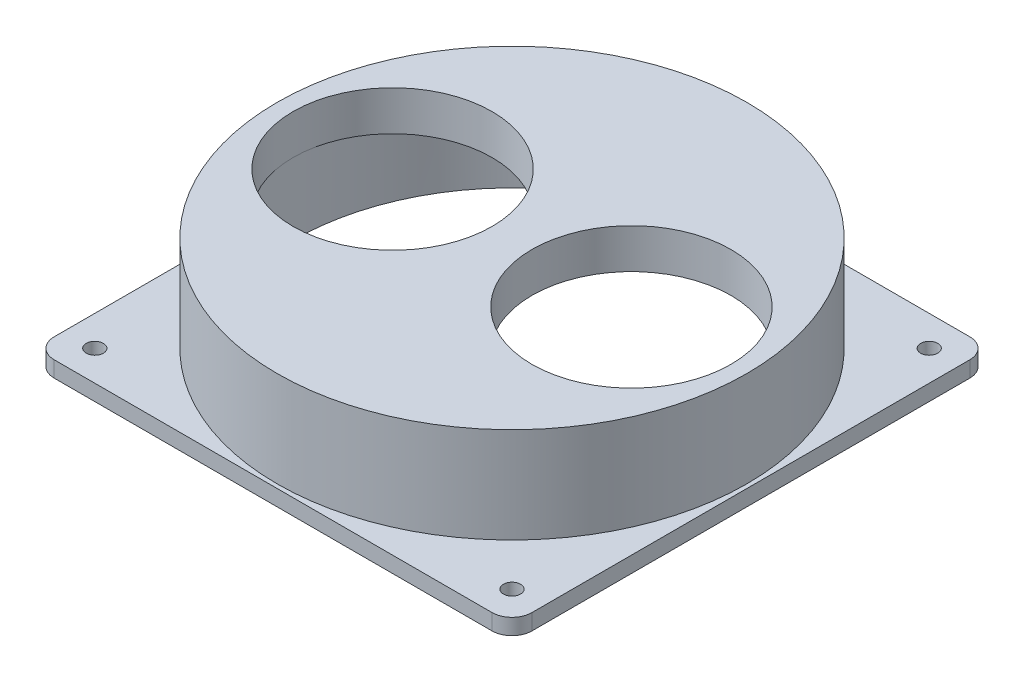
ISO-10303-21;
HEADER;
FILE_DESCRIPTION(('STEP AP214'),'2;1');
FILE_NAME('part.step','',(''),(''),'','','');
FILE_SCHEMA(('AUTOMOTIVE_DESIGN { 1 0 10303 214 1 1 1 1 }'));
ENDSEC;
DATA;
#1=APPLICATION_CONTEXT('core data for automotive mechanical design processes');
#2=APPLICATION_PROTOCOL_DEFINITION('international standard','automotive_design',2000,#1);
#3=PRODUCT_CONTEXT('',#1,'mechanical');
#4=PRODUCT('Part','Part','',(#3));
#5=PRODUCT_RELATED_PRODUCT_CATEGORY('part','',(#4));
#6=PRODUCT_DEFINITION_FORMATION('','',#4);
#7=PRODUCT_DEFINITION_CONTEXT('part definition',#1,'design');
#8=PRODUCT_DEFINITION('design','',#6,#7);
#9=PRODUCT_DEFINITION_SHAPE('','',#8);
#10=(LENGTH_UNIT() NAMED_UNIT(*) SI_UNIT(.MILLI.,.METRE.));
#11=(NAMED_UNIT(*) PLANE_ANGLE_UNIT() SI_UNIT($,.RADIAN.));
#12=(NAMED_UNIT(*) SI_UNIT($,.STERADIAN.) SOLID_ANGLE_UNIT());
#13=UNCERTAINTY_MEASURE_WITH_UNIT(LENGTH_MEASURE(1.E-05),#10,'distance_accuracy_value','');
#14=(GEOMETRIC_REPRESENTATION_CONTEXT(3) GLOBAL_UNCERTAINTY_ASSIGNED_CONTEXT((#13)) GLOBAL_UNIT_ASSIGNED_CONTEXT((#10,
#11,#12)) REPRESENTATION_CONTEXT('',''));
#15=CARTESIAN_POINT('',(0.,0.,0.));
#16=DIRECTION('',(0.,0.,1.));
#17=DIRECTION('',(1.,0.,0.));
#18=AXIS2_PLACEMENT_3D('',#15,#16,#17);
#19=CARTESIAN_POINT('',(0.,0.,0.));
#20=DIRECTION('',(0.,1.,0.));
#21=DIRECTION('',(0.,0.,1.));
#22=AXIS2_PLACEMENT_3D('',#19,#20,#21);
#23=CYLINDRICAL_SURFACE('',#22,55.);
#24=CARTESIAN_POINT('',(0.,0.,0.));
#25=DIRECTION('',(0.,1.,0.));
#26=DIRECTION('',(0.,0.,1.));
#27=AXIS2_PLACEMENT_3D('',#24,#25,#26);
#28=CIRCLE('',#27,55.);
#29=CARTESIAN_POINT('',(0.,0.,55.));
#30=VERTEX_POINT('',#29);
#31=EDGE_CURVE('E180',#30,#30,#28,.T.);
#32=ORIENTED_EDGE('',*,*,#31,.F.);
#33=EDGE_LOOP('',(#32));
#34=FACE_BOUND('',#33,.T.);
#35=DIRECTION('',(0.,1.,0.));
#36=VECTOR('',#35,1.);
#37=CARTESIAN_POINT('',(-51.4,21.,-19.5714077163601));
#38=LINE('',#37,#36);
#39=CARTESIAN_POINT('',(-51.4,18.,-19.5714077163601));
#40=VERTEX_POINT('',#39);
#41=CARTESIAN_POINT('',(-51.4,24.,-19.5714077163601));
#42=VERTEX_POINT('',#41);
#43=EDGE_CURVE('E48',#40,#42,#38,.T.);
#44=ORIENTED_EDGE('',*,*,#43,.F.);
#45=CARTESIAN_POINT('',(0.,18.,0.));
#46=DIRECTION('',(0.,-1.,0.));
#47=DIRECTION('',(0.,0.,-1.));
#48=AXIS2_PLACEMENT_3D('',#45,#46,#47);
#49=CIRCLE('',#48,55.);
#50=CARTESIAN_POINT('',(-55.,18.,0.));
#51=VERTEX_POINT('',#50);
#52=EDGE_CURVE('E153',#40,#51,#49,.F.);
#53=ORIENTED_EDGE('',*,*,#52,.T.);
#54=CARTESIAN_POINT('',(-51.4,18.,19.5714077163601));
#55=VERTEX_POINT('',#54);
#56=EDGE_CURVE('E54',#51,#55,#49,.F.);
#57=ORIENTED_EDGE('',*,*,#56,.T.);
#58=DIRECTION('',(0.,1.,0.));
#59=VECTOR('',#58,1.);
#60=CARTESIAN_POINT('',(-51.4,21.,19.5714077163601));
#61=LINE('',#60,#59);
#62=CARTESIAN_POINT('',(-51.4,24.,19.5714077163601));
#63=VERTEX_POINT('',#62);
#64=EDGE_CURVE('E138',#63,#55,#61,.F.);
#65=ORIENTED_EDGE('',*,*,#64,.F.);
#66=CARTESIAN_POINT('',(0.,24.,0.));
#67=DIRECTION('',(0.,1.,0.));
#68=DIRECTION('',(0.,0.,1.));
#69=AXIS2_PLACEMENT_3D('',#66,#67,#68);
#70=CIRCLE('',#69,55.);
#71=CARTESIAN_POINT('',(51.4,24.,19.5714077163601));
#72=VERTEX_POINT('',#71);
#73=EDGE_CURVE('E128',#72,#63,#70,.F.);
#74=ORIENTED_EDGE('',*,*,#73,.F.);
#75=DIRECTION('',(0.,1.,0.));
#76=VECTOR('',#75,1.);
#77=CARTESIAN_POINT('',(51.4,21.,19.5714077163601));
#78=LINE('',#77,#76);
#79=CARTESIAN_POINT('',(51.4,18.,19.5714077163601));
#80=VERTEX_POINT('',#79);
#81=EDGE_CURVE('E160',#80,#72,#78,.T.);
#82=ORIENTED_EDGE('',*,*,#81,.F.);
#83=CARTESIAN_POINT('',(0.,18.,0.));
#84=DIRECTION('',(0.,-1.,0.));
#85=DIRECTION('',(0.,0.,-1.));
#86=AXIS2_PLACEMENT_3D('',#83,#84,#85);
#87=CIRCLE('',#86,55.);
#88=CARTESIAN_POINT('',(55.,18.,0.));
#89=VERTEX_POINT('',#88);
#90=EDGE_CURVE('E168',#80,#89,#87,.F.);
#91=ORIENTED_EDGE('',*,*,#90,.T.);
#92=CARTESIAN_POINT('',(51.4,18.,-19.5714077163601));
#93=VERTEX_POINT('',#92);
#94=EDGE_CURVE('E166',#89,#93,#87,.F.);
#95=ORIENTED_EDGE('',*,*,#94,.T.);
#96=DIRECTION('',(0.,1.,0.));
#97=VECTOR('',#96,1.);
#98=CARTESIAN_POINT('',(51.4,21.,-19.5714077163601));
#99=LINE('',#98,#97);
#100=CARTESIAN_POINT('',(51.4,24.,-19.5714077163601));
#101=VERTEX_POINT('',#100);
#102=EDGE_CURVE('E163',#101,#93,#99,.F.);
#103=ORIENTED_EDGE('',*,*,#102,.F.);
#104=EDGE_CURVE('E136',#42,#101,#70,.F.);
#105=ORIENTED_EDGE('',*,*,#104,.F.);
#106=EDGE_LOOP('',(#44,#53,#57,#65,#74,#82,#91,#95,#103,#105));
#107=FACE_BOUND('',#106,.T.);
#108=ADVANCED_FACE('F33',(#34,#107),#23,.F.);
#109=CARTESIAN_POINT('',(0.,24.,0.));
#110=DIRECTION('',(0.,1.,0.));
#111=DIRECTION('',(0.,0.,1.));
#112=AXIS2_PLACEMENT_3D('',#109,#110,#111);
#113=PLANE('',#112);
#114=CARTESIAN_POINT('',(-30.,24.,0.));
#115=DIRECTION('',(0.,-1.,0.));
#116=DIRECTION('',(0.,0.,-1.));
#117=AXIS2_PLACEMENT_3D('',#114,#115,#116);
#118=CIRCLE('',#117,29.);
#119=EDGE_CURVE('E131',#42,#63,#118,.T.);
#120=ORIENTED_EDGE('',*,*,#119,.F.);
#121=ORIENTED_EDGE('',*,*,#104,.T.);
#122=CARTESIAN_POINT('',(30.,24.,0.));
#123=DIRECTION('',(0.,-1.,0.));
#124=DIRECTION('',(0.,0.,-1.));
#125=AXIS2_PLACEMENT_3D('',#122,#123,#124);
#126=CIRCLE('',#125,29.);
#127=EDGE_CURVE('E133',#72,#101,#126,.T.);
#128=ORIENTED_EDGE('',*,*,#127,.F.);
#129=ORIENTED_EDGE('',*,*,#73,.T.);
#130=EDGE_LOOP('',(#120,#121,#128,#129));
#131=FACE_BOUND('',#130,.T.);
#132=ADVANCED_FACE('F129',(#131),#113,.F.);
#133=CARTESIAN_POINT('',(0.,4.,0.));
#134=DIRECTION('',(0.,1.,0.));
#135=DIRECTION('',(0.,0.,1.));
#136=AXIS2_PLACEMENT_3D('',#133,#134,#135);
#137=PLANE('',#136);
#138=DIRECTION('',(0.,0.,-1.));
#139=VECTOR('',#138,1.);
#140=CARTESIAN_POINT('',(60.,4.,-60.));
#141=LINE('',#140,#139);
#142=CARTESIAN_POINT('',(60.,4.,55.));
#143=VERTEX_POINT('',#142);
#144=CARTESIAN_POINT('',(60.,4.,-55.));
#145=VERTEX_POINT('',#144);
#146=EDGE_CURVE('E208',#143,#145,#141,.T.);
#147=ORIENTED_EDGE('',*,*,#146,.T.);
#148=CARTESIAN_POINT('',(55.,4.,-55.));
#149=DIRECTION('',(0.,1.,0.));
#150=DIRECTION('',(0.,0.,1.));
#151=AXIS2_PLACEMENT_3D('',#148,#149,#150);
#152=CIRCLE('',#151,5.);
#153=CARTESIAN_POINT('',(55.,4.,-60.));
#154=VERTEX_POINT('',#153);
#155=EDGE_CURVE('E255',#145,#154,#152,.T.);
#156=ORIENTED_EDGE('',*,*,#155,.T.);
#157=DIRECTION('',(-1.,0.,0.));
#158=VECTOR('',#157,1.);
#159=CARTESIAN_POINT('',(-60.,4.,-60.));
#160=LINE('',#159,#158);
#161=CARTESIAN_POINT('',(-55.,4.,-60.));
#162=VERTEX_POINT('',#161);
#163=EDGE_CURVE('E211',#154,#162,#160,.T.);
#164=ORIENTED_EDGE('',*,*,#163,.T.);
#165=CARTESIAN_POINT('',(-55.,4.,-55.));
#166=DIRECTION('',(0.,1.,0.));
#167=DIRECTION('',(0.,0.,1.));
#168=AXIS2_PLACEMENT_3D('',#165,#166,#167);
#169=CIRCLE('',#168,5.);
#170=CARTESIAN_POINT('',(-60.,4.,-55.));
#171=VERTEX_POINT('',#170);
#172=EDGE_CURVE('E253',#162,#171,#169,.T.);
#173=ORIENTED_EDGE('',*,*,#172,.T.);
#174=DIRECTION('',(0.,0.,1.));
#175=VECTOR('',#174,1.);
#176=CARTESIAN_POINT('',(-60.,4.,-60.));
#177=LINE('',#176,#175);
#178=CARTESIAN_POINT('',(-60.,4.,55.));
#179=VERTEX_POINT('',#178);
#180=EDGE_CURVE('E215',#171,#179,#177,.T.);
#181=ORIENTED_EDGE('',*,*,#180,.T.);
#182=CARTESIAN_POINT('',(-55.,4.,55.));
#183=DIRECTION('',(0.,1.,0.));
#184=DIRECTION('',(0.,0.,1.));
#185=AXIS2_PLACEMENT_3D('',#182,#183,#184);
#186=CIRCLE('',#185,5.);
#187=CARTESIAN_POINT('',(-55.,4.,60.));
#188=VERTEX_POINT('',#187);
#189=EDGE_CURVE('E251',#179,#188,#186,.T.);
#190=ORIENTED_EDGE('',*,*,#189,.T.);
#191=DIRECTION('',(1.,0.,0.));
#192=VECTOR('',#191,1.);
#193=CARTESIAN_POINT('',(-60.,4.,60.));
#194=LINE('',#193,#192);
#195=CARTESIAN_POINT('',(55.,4.,60.));
#196=VERTEX_POINT('',#195);
#197=EDGE_CURVE('E218',#188,#196,#194,.T.);
#198=ORIENTED_EDGE('',*,*,#197,.T.);
#199=CARTESIAN_POINT('',(55.,4.,55.));
#200=DIRECTION('',(0.,1.,0.));
#201=DIRECTION('',(0.,0.,1.));
#202=AXIS2_PLACEMENT_3D('',#199,#200,#201);
#203=CIRCLE('',#202,5.);
#204=EDGE_CURVE('E249',#196,#143,#203,.T.);
#205=ORIENTED_EDGE('',*,*,#204,.T.);
#206=EDGE_LOOP('',(#147,#156,#164,#173,#181,#190,#198,#205));
#207=FACE_BOUND('',#206,.T.);
#208=CARTESIAN_POINT('',(-52.4,4.,-52.4));
#209=DIRECTION('',(0.,1.,0.));
#210=DIRECTION('',(0.,0.,1.));
#211=AXIS2_PLACEMENT_3D('',#208,#209,#210);
#212=CIRCLE('',#211,2.15);
#213=CARTESIAN_POINT('',(-52.4,4.,-50.25));
#214=VERTEX_POINT('',#213);
#215=EDGE_CURVE('E187',#214,#214,#212,.T.);
#216=ORIENTED_EDGE('',*,*,#215,.F.);
#217=EDGE_LOOP('',(#216));
#218=FACE_BOUND('',#217,.T.);
#219=CARTESIAN_POINT('',(52.4,4.,52.4));
#220=DIRECTION('',(0.,1.,0.));
#221=DIRECTION('',(0.,0.,1.));
#222=AXIS2_PLACEMENT_3D('',#219,#220,#221);
#223=CIRCLE('',#222,2.15);
#224=CARTESIAN_POINT('',(52.4,4.,54.55));
#225=VERTEX_POINT('',#224);
#226=EDGE_CURVE('E183',#225,#225,#223,.T.);
#227=ORIENTED_EDGE('',*,*,#226,.F.);
#228=EDGE_LOOP('',(#227));
#229=FACE_BOUND('',#228,.T.);
#230=CARTESIAN_POINT('',(-52.4,4.,52.4));
#231=DIRECTION('',(0.,1.,0.));
#232=DIRECTION('',(0.,0.,1.));
#233=AXIS2_PLACEMENT_3D('',#230,#231,#232);
#234=CIRCLE('',#233,2.15);
#235=CARTESIAN_POINT('',(-52.4,4.,54.55));
#236=VERTEX_POINT('',#235);
#237=EDGE_CURVE('E194',#236,#236,#234,.T.);
#238=ORIENTED_EDGE('',*,*,#237,.F.);
#239=EDGE_LOOP('',(#238));
#240=FACE_BOUND('',#239,.T.);
#241=CARTESIAN_POINT('',(52.4,4.,-52.4));
#242=DIRECTION('',(0.,1.,0.));
#243=DIRECTION('',(0.,0.,1.));
#244=AXIS2_PLACEMENT_3D('',#241,#242,#243);
#245=CIRCLE('',#244,2.15);
#246=CARTESIAN_POINT('',(52.4,4.,-50.25));
#247=VERTEX_POINT('',#246);
#248=EDGE_CURVE('E188',#247,#247,#245,.T.);
#249=ORIENTED_EDGE('',*,*,#248,.F.);
#250=EDGE_LOOP('',(#249));
#251=FACE_BOUND('',#250,.T.);
#252=CARTESIAN_POINT('',(0.,4.,0.));
#253=DIRECTION('',(0.,1.,0.));
#254=DIRECTION('',(0.,0.,1.));
#255=AXIS2_PLACEMENT_3D('',#252,#253,#254);
#256=CIRCLE('',#255,59.);
#257=CARTESIAN_POINT('',(0.,4.,59.));
#258=VERTEX_POINT('',#257);
#259=EDGE_CURVE('E135',#258,#258,#256,.T.);
#260=ORIENTED_EDGE('',*,*,#259,.F.);
#261=EDGE_LOOP('',(#260));
#262=FACE_BOUND('',#261,.T.);
#263=ADVANCED_FACE('F270',(#207,#218,#229,#240,#251,#262),#137,.T.);
#264=CARTESIAN_POINT('',(60.,4.,-60.));
#265=DIRECTION('',(-1.,0.,0.));
#266=DIRECTION('',(0.,0.,1.));
#267=AXIS2_PLACEMENT_3D('',#264,#265,#266);
#268=PLANE('',#267);
#269=DIRECTION('',(0.,0.,-1.));
#270=VECTOR('',#269,1.);
#271=CARTESIAN_POINT('',(60.,0.,-60.));
#272=LINE('',#271,#270);
#273=CARTESIAN_POINT('',(60.,0.,55.));
#274=VERTEX_POINT('',#273);
#275=CARTESIAN_POINT('',(60.,0.,-55.));
#276=VERTEX_POINT('',#275);
#277=EDGE_CURVE('E205',#274,#276,#272,.T.);
#278=ORIENTED_EDGE('',*,*,#277,.T.);
#279=DIRECTION('',(0.,-1.,0.));
#280=VECTOR('',#279,1.);
#281=CARTESIAN_POINT('',(60.,4.,-55.));
#282=LINE('',#281,#280);
#283=EDGE_CURVE('E247',#276,#145,#282,.F.);
#284=ORIENTED_EDGE('',*,*,#283,.T.);
#285=ORIENTED_EDGE('',*,*,#146,.F.);
#286=DIRECTION('',(0.,-1.,0.));
#287=VECTOR('',#286,1.);
#288=CARTESIAN_POINT('',(60.,4.,55.));
#289=LINE('',#288,#287);
#290=EDGE_CURVE('E244',#143,#274,#289,.T.);
#291=ORIENTED_EDGE('',*,*,#290,.T.);
#292=EDGE_LOOP('',(#278,#284,#285,#291));
#293=FACE_BOUND('',#292,.T.);
#294=ADVANCED_FACE('F277',(#293),#268,.F.);
#295=CARTESIAN_POINT('',(-60.,4.,-60.));
#296=DIRECTION('',(0.,0.,1.));
#297=DIRECTION('',(1.,0.,0.));
#298=AXIS2_PLACEMENT_3D('',#295,#296,#297);
#299=PLANE('',#298);
#300=ORIENTED_EDGE('',*,*,#163,.F.);
#301=DIRECTION('',(0.,-1.,0.));
#302=VECTOR('',#301,1.);
#303=CARTESIAN_POINT('',(55.,4.,-60.));
#304=LINE('',#303,#302);
#305=CARTESIAN_POINT('',(55.,0.,-60.));
#306=VERTEX_POINT('',#305);
#307=EDGE_CURVE('E233',#154,#306,#304,.T.);
#308=ORIENTED_EDGE('',*,*,#307,.T.);
#309=DIRECTION('',(-1.,0.,0.));
#310=VECTOR('',#309,1.);
#311=CARTESIAN_POINT('',(-60.,0.,-60.));
#312=LINE('',#311,#310);
#313=CARTESIAN_POINT('',(-55.,0.,-60.));
#314=VERTEX_POINT('',#313);
#315=EDGE_CURVE('E224',#306,#314,#312,.T.);
#316=ORIENTED_EDGE('',*,*,#315,.T.);
#317=DIRECTION('',(0.,-1.,0.));
#318=VECTOR('',#317,1.);
#319=CARTESIAN_POINT('',(-55.,4.,-60.));
#320=LINE('',#319,#318);
#321=EDGE_CURVE('E221',#314,#162,#320,.F.);
#322=ORIENTED_EDGE('',*,*,#321,.T.);
#323=EDGE_LOOP('',(#300,#308,#316,#322));
#324=FACE_BOUND('',#323,.T.);
#325=ADVANCED_FACE('F288',(#324),#299,.F.);
#326=CARTESIAN_POINT('',(-60.,4.,-60.));
#327=DIRECTION('',(1.,0.,0.));
#328=DIRECTION('',(0.,0.,-1.));
#329=AXIS2_PLACEMENT_3D('',#326,#327,#328);
#330=PLANE('',#329);
#331=ORIENTED_EDGE('',*,*,#180,.F.);
#332=DIRECTION('',(0.,-1.,0.));
#333=VECTOR('',#332,1.);
#334=CARTESIAN_POINT('',(-60.,4.,-55.));
#335=LINE('',#334,#333);
#336=CARTESIAN_POINT('',(-60.,0.,-55.));
#337=VERTEX_POINT('',#336);
#338=EDGE_CURVE('E259',#171,#337,#335,.T.);
#339=ORIENTED_EDGE('',*,*,#338,.T.);
#340=DIRECTION('',(0.,0.,1.));
#341=VECTOR('',#340,1.);
#342=CARTESIAN_POINT('',(-60.,0.,-60.));
#343=LINE('',#342,#341);
#344=CARTESIAN_POINT('',(-60.,0.,55.));
#345=VERTEX_POINT('',#344);
#346=EDGE_CURVE('E227',#337,#345,#343,.T.);
#347=ORIENTED_EDGE('',*,*,#346,.T.);
#348=DIRECTION('',(0.,-1.,0.));
#349=VECTOR('',#348,1.);
#350=CARTESIAN_POINT('',(-60.,4.,55.));
#351=LINE('',#350,#349);
#352=EDGE_CURVE('E257',#345,#179,#351,.F.);
#353=ORIENTED_EDGE('',*,*,#352,.T.);
#354=EDGE_LOOP('',(#331,#339,#347,#353));
#355=FACE_BOUND('',#354,.T.);
#356=ADVANCED_FACE('F297',(#355),#330,.F.);
#357=CARTESIAN_POINT('',(-60.,4.,60.));
#358=DIRECTION('',(0.,0.,-1.));
#359=DIRECTION('',(-1.,0.,0.));
#360=AXIS2_PLACEMENT_3D('',#357,#358,#359);
#361=PLANE('',#360);
#362=ORIENTED_EDGE('',*,*,#197,.F.);
#363=DIRECTION('',(0.,-1.,0.));
#364=VECTOR('',#363,1.);
#365=CARTESIAN_POINT('',(-55.,4.,60.));
#366=LINE('',#365,#364);
#367=CARTESIAN_POINT('',(-55.,0.,60.));
#368=VERTEX_POINT('',#367);
#369=EDGE_CURVE('E11',#188,#368,#366,.T.);
#370=ORIENTED_EDGE('',*,*,#369,.T.);
#371=DIRECTION('',(1.,0.,0.));
#372=VECTOR('',#371,1.);
#373=CARTESIAN_POINT('',(-60.,0.,60.));
#374=LINE('',#373,#372);
#375=CARTESIAN_POINT('',(55.,0.,60.));
#376=VERTEX_POINT('',#375);
#377=EDGE_CURVE('E212',#368,#376,#374,.T.);
#378=ORIENTED_EDGE('',*,*,#377,.T.);
#379=DIRECTION('',(0.,-1.,0.));
#380=VECTOR('',#379,1.);
#381=CARTESIAN_POINT('',(55.,4.,60.));
#382=LINE('',#381,#380);
#383=EDGE_CURVE('E41',#376,#196,#382,.F.);
#384=ORIENTED_EDGE('',*,*,#383,.T.);
#385=EDGE_LOOP('',(#362,#370,#378,#384));
#386=FACE_BOUND('',#385,.T.);
#387=ADVANCED_FACE('F264',(#386),#361,.F.);
#388=CARTESIAN_POINT('',(0.,0.,0.));
#389=DIRECTION('',(0.,1.,0.));
#390=DIRECTION('',(0.,0.,1.));
#391=AXIS2_PLACEMENT_3D('',#388,#389,#390);
#392=PLANE('',#391);
#393=ORIENTED_EDGE('',*,*,#31,.T.);
#394=EDGE_LOOP('',(#393));
#395=FACE_BOUND('',#394,.T.);
#396=CARTESIAN_POINT('',(52.4,0.,-52.4));
#397=DIRECTION('',(0.,1.,0.));
#398=DIRECTION('',(0.,0.,1.));
#399=AXIS2_PLACEMENT_3D('',#396,#397,#398);
#400=CIRCLE('',#399,2.15);
#401=CARTESIAN_POINT('',(52.4,0.,-50.25));
#402=VERTEX_POINT('',#401);
#403=EDGE_CURVE('E184',#402,#402,#400,.T.);
#404=ORIENTED_EDGE('',*,*,#403,.T.);
#405=EDGE_LOOP('',(#404));
#406=FACE_BOUND('',#405,.T.);
#407=CARTESIAN_POINT('',(-52.4,0.,52.4));
#408=DIRECTION('',(0.,1.,0.));
#409=DIRECTION('',(0.,0.,1.));
#410=AXIS2_PLACEMENT_3D('',#407,#408,#409);
#411=CIRCLE('',#410,2.15);
#412=CARTESIAN_POINT('',(-52.4,0.,54.55));
#413=VERTEX_POINT('',#412);
#414=EDGE_CURVE('E191',#413,#413,#411,.T.);
#415=ORIENTED_EDGE('',*,*,#414,.T.);
#416=EDGE_LOOP('',(#415));
#417=FACE_BOUND('',#416,.T.);
#418=CARTESIAN_POINT('',(52.4,0.,52.4));
#419=DIRECTION('',(0.,1.,0.));
#420=DIRECTION('',(0.,0.,1.));
#421=AXIS2_PLACEMENT_3D('',#418,#419,#420);
#422=CIRCLE('',#421,2.15);
#423=CARTESIAN_POINT('',(52.4,0.,54.55));
#424=VERTEX_POINT('',#423);
#425=EDGE_CURVE('E197',#424,#424,#422,.T.);
#426=ORIENTED_EDGE('',*,*,#425,.T.);
#427=EDGE_LOOP('',(#426));
#428=FACE_BOUND('',#427,.T.);
#429=CARTESIAN_POINT('',(-52.4,0.,-52.4));
#430=DIRECTION('',(0.,1.,0.));
#431=DIRECTION('',(0.,0.,1.));
#432=AXIS2_PLACEMENT_3D('',#429,#430,#431);
#433=CIRCLE('',#432,2.15);
#434=CARTESIAN_POINT('',(-52.4,0.,-50.25));
#435=VERTEX_POINT('',#434);
#436=EDGE_CURVE('E202',#435,#435,#433,.T.);
#437=ORIENTED_EDGE('',*,*,#436,.T.);
#438=EDGE_LOOP('',(#437));
#439=FACE_BOUND('',#438,.T.);
#440=ORIENTED_EDGE('',*,*,#315,.F.);
#441=CARTESIAN_POINT('',(55.,0.,-55.));
#442=DIRECTION('',(0.,1.,0.));
#443=DIRECTION('',(0.,0.,1.));
#444=AXIS2_PLACEMENT_3D('',#441,#442,#443);
#445=CIRCLE('',#444,5.);
#446=EDGE_CURVE('E242',#306,#276,#445,.F.);
#447=ORIENTED_EDGE('',*,*,#446,.T.);
#448=ORIENTED_EDGE('',*,*,#277,.F.);
#449=CARTESIAN_POINT('',(55.,0.,55.));
#450=DIRECTION('',(0.,1.,0.));
#451=DIRECTION('',(0.,0.,1.));
#452=AXIS2_PLACEMENT_3D('',#449,#450,#451);
#453=CIRCLE('',#452,5.);
#454=EDGE_CURVE('E236',#274,#376,#453,.F.);
#455=ORIENTED_EDGE('',*,*,#454,.T.);
#456=ORIENTED_EDGE('',*,*,#377,.F.);
#457=CARTESIAN_POINT('',(-55.,0.,55.));
#458=DIRECTION('',(0.,1.,0.));
#459=DIRECTION('',(0.,0.,1.));
#460=AXIS2_PLACEMENT_3D('',#457,#458,#459);
#461=CIRCLE('',#460,5.);
#462=EDGE_CURVE('E238',#368,#345,#461,.F.);
#463=ORIENTED_EDGE('',*,*,#462,.T.);
#464=ORIENTED_EDGE('',*,*,#346,.F.);
#465=CARTESIAN_POINT('',(-55.,0.,-55.));
#466=DIRECTION('',(0.,1.,0.));
#467=DIRECTION('',(0.,0.,1.));
#468=AXIS2_PLACEMENT_3D('',#465,#466,#467);
#469=CIRCLE('',#468,5.);
#470=EDGE_CURVE('E240',#337,#314,#469,.F.);
#471=ORIENTED_EDGE('',*,*,#470,.T.);
#472=EDGE_LOOP('',(#440,#447,#448,#455,#456,#463,#464,#471));
#473=FACE_BOUND('',#472,.T.);
#474=ADVANCED_FACE('F281',(#395,#406,#417,#428,#439,#473),#392,.F.);
#475=CARTESIAN_POINT('',(55.,4.,-55.));
#476=DIRECTION('',(0.,-1.,0.));
#477=DIRECTION('',(0.,0.,-1.));
#478=AXIS2_PLACEMENT_3D('',#475,#476,#477);
#479=CYLINDRICAL_SURFACE('',#478,5.);
#480=ORIENTED_EDGE('',*,*,#155,.F.);
#481=ORIENTED_EDGE('',*,*,#283,.F.);
#482=ORIENTED_EDGE('',*,*,#446,.F.);
#483=ORIENTED_EDGE('',*,*,#307,.F.);
#484=EDGE_LOOP('',(#480,#481,#482,#483));
#485=FACE_BOUND('',#484,.T.);
#486=ADVANCED_FACE('F285',(#485),#479,.T.);
#487=CARTESIAN_POINT('',(-55.,4.,-55.));
#488=DIRECTION('',(0.,-1.,0.));
#489=DIRECTION('',(0.,0.,-1.));
#490=AXIS2_PLACEMENT_3D('',#487,#488,#489);
#491=CYLINDRICAL_SURFACE('',#490,5.);
#492=ORIENTED_EDGE('',*,*,#172,.F.);
#493=ORIENTED_EDGE('',*,*,#321,.F.);
#494=ORIENTED_EDGE('',*,*,#470,.F.);
#495=ORIENTED_EDGE('',*,*,#338,.F.);
#496=EDGE_LOOP('',(#492,#493,#494,#495));
#497=FACE_BOUND('',#496,.T.);
#498=ADVANCED_FACE('F294',(#497),#491,.T.);
#499=CARTESIAN_POINT('',(-55.,4.,55.));
#500=DIRECTION('',(0.,-1.,0.));
#501=DIRECTION('',(0.,0.,-1.));
#502=AXIS2_PLACEMENT_3D('',#499,#500,#501);
#503=CYLINDRICAL_SURFACE('',#502,5.);
#504=ORIENTED_EDGE('',*,*,#189,.F.);
#505=ORIENTED_EDGE('',*,*,#352,.F.);
#506=ORIENTED_EDGE('',*,*,#462,.F.);
#507=ORIENTED_EDGE('',*,*,#369,.F.);
#508=EDGE_LOOP('',(#504,#505,#506,#507));
#509=FACE_BOUND('',#508,.T.);
#510=ADVANCED_FACE('F300',(#509),#503,.T.);
#511=CARTESIAN_POINT('',(55.,4.,55.));
#512=DIRECTION('',(0.,-1.,0.));
#513=DIRECTION('',(0.,0.,-1.));
#514=AXIS2_PLACEMENT_3D('',#511,#512,#513);
#515=CYLINDRICAL_SURFACE('',#514,5.);
#516=ORIENTED_EDGE('',*,*,#204,.F.);
#517=ORIENTED_EDGE('',*,*,#383,.F.);
#518=ORIENTED_EDGE('',*,*,#454,.F.);
#519=ORIENTED_EDGE('',*,*,#290,.F.);
#520=EDGE_LOOP('',(#516,#517,#518,#519));
#521=FACE_BOUND('',#520,.T.);
#522=ADVANCED_FACE('F35',(#521),#515,.T.);
#523=CARTESIAN_POINT('',(-52.4,0.,-52.4));
#524=DIRECTION('',(0.,1.,0.));
#525=DIRECTION('',(0.,0.,1.));
#526=AXIS2_PLACEMENT_3D('',#523,#524,#525);
#527=CYLINDRICAL_SURFACE('',#526,2.15);
#528=ORIENTED_EDGE('',*,*,#436,.F.);
#529=EDGE_LOOP('',(#528));
#530=FACE_BOUND('',#529,.T.);
#531=ORIENTED_EDGE('',*,*,#215,.T.);
#532=EDGE_LOOP('',(#531));
#533=FACE_BOUND('',#532,.T.);
#534=ADVANCED_FACE('F306',(#530,#533),#527,.F.);
#535=CARTESIAN_POINT('',(52.4,0.,52.4));
#536=DIRECTION('',(0.,1.,0.));
#537=DIRECTION('',(0.,0.,1.));
#538=AXIS2_PLACEMENT_3D('',#535,#536,#537);
#539=CYLINDRICAL_SURFACE('',#538,2.15);
#540=ORIENTED_EDGE('',*,*,#425,.F.);
#541=EDGE_LOOP('',(#540));
#542=FACE_BOUND('',#541,.T.);
#543=ORIENTED_EDGE('',*,*,#226,.T.);
#544=EDGE_LOOP('',(#543));
#545=FACE_BOUND('',#544,.T.);
#546=ADVANCED_FACE('F326',(#542,#545),#539,.F.);
#547=CARTESIAN_POINT('',(-52.4,0.,52.4));
#548=DIRECTION('',(0.,1.,0.));
#549=DIRECTION('',(0.,0.,1.));
#550=AXIS2_PLACEMENT_3D('',#547,#548,#549);
#551=CYLINDRICAL_SURFACE('',#550,2.15);
#552=ORIENTED_EDGE('',*,*,#414,.F.);
#553=EDGE_LOOP('',(#552));
#554=FACE_BOUND('',#553,.T.);
#555=ORIENTED_EDGE('',*,*,#237,.T.);
#556=EDGE_LOOP('',(#555));
#557=FACE_BOUND('',#556,.T.);
#558=ADVANCED_FACE('F322',(#554,#557),#551,.F.);
#559=CARTESIAN_POINT('',(52.4,0.,-52.4));
#560=DIRECTION('',(0.,1.,0.));
#561=DIRECTION('',(0.,0.,1.));
#562=AXIS2_PLACEMENT_3D('',#559,#560,#561);
#563=CYLINDRICAL_SURFACE('',#562,2.15);
#564=ORIENTED_EDGE('',*,*,#403,.F.);
#565=EDGE_LOOP('',(#564));
#566=FACE_BOUND('',#565,.T.);
#567=ORIENTED_EDGE('',*,*,#248,.T.);
#568=EDGE_LOOP('',(#567));
#569=FACE_BOUND('',#568,.T.);
#570=ADVANCED_FACE('F319',(#566,#569),#563,.F.);
#571=CARTESIAN_POINT('',(0.,24.,0.));
#572=DIRECTION('',(0.,-1.,0.));
#573=DIRECTION('',(0.,0.,-1.));
#574=AXIS2_PLACEMENT_3D('',#571,#572,#573);
#575=CYLINDRICAL_SURFACE('',#574,59.);
#576=ORIENTED_EDGE('',*,*,#259,.T.);
#577=EDGE_LOOP('',(#576));
#578=FACE_BOUND('',#577,.T.);
#579=CARTESIAN_POINT('',(0.,28.,0.));
#580=DIRECTION('',(0.,1.,0.));
#581=DIRECTION('',(0.,0.,1.));
#582=AXIS2_PLACEMENT_3D('',#579,#580,#581);
#583=CIRCLE('',#582,59.);
#584=CARTESIAN_POINT('',(0.,28.,59.));
#585=VERTEX_POINT('',#584);
#586=EDGE_CURVE('E175',#585,#585,#583,.T.);
#587=ORIENTED_EDGE('',*,*,#586,.F.);
#588=EDGE_LOOP('',(#587));
#589=FACE_BOUND('',#588,.T.);
#590=ADVANCED_FACE('F318',(#578,#589),#575,.T.);
#591=CARTESIAN_POINT('',(0.,28.,0.));
#592=DIRECTION('',(0.,1.,0.));
#593=DIRECTION('',(0.,0.,1.));
#594=AXIS2_PLACEMENT_3D('',#591,#592,#593);
#595=PLANE('',#594);
#596=CARTESIAN_POINT('',(-30.,28.,0.));
#597=DIRECTION('',(0.,1.,0.));
#598=DIRECTION('',(0.,0.,1.));
#599=AXIS2_PLACEMENT_3D('',#596,#597,#598);
#600=CIRCLE('',#599,25.);
#601=CARTESIAN_POINT('',(-30.,28.,25.));
#602=VERTEX_POINT('',#601);
#603=EDGE_CURVE('E169',#602,#602,#600,.T.);
#604=ORIENTED_EDGE('',*,*,#603,.F.);
#605=EDGE_LOOP('',(#604));
#606=FACE_BOUND('',#605,.T.);
#607=CARTESIAN_POINT('',(30.,28.,0.));
#608=DIRECTION('',(0.,1.,0.));
#609=DIRECTION('',(0.,0.,1.));
#610=AXIS2_PLACEMENT_3D('',#607,#608,#609);
#611=CIRCLE('',#610,25.);
#612=CARTESIAN_POINT('',(30.,28.,25.));
#613=VERTEX_POINT('',#612);
#614=EDGE_CURVE('E172',#613,#613,#611,.T.);
#615=ORIENTED_EDGE('',*,*,#614,.F.);
#616=EDGE_LOOP('',(#615));
#617=FACE_BOUND('',#616,.T.);
#618=ORIENTED_EDGE('',*,*,#586,.T.);
#619=EDGE_LOOP('',(#618));
#620=FACE_BOUND('',#619,.T.);
#621=ADVANCED_FACE('F409',(#606,#617,#620),#595,.T.);
#622=CARTESIAN_POINT('',(30.,24.,0.));
#623=DIRECTION('',(0.,1.,0.));
#624=DIRECTION('',(0.,0.,1.));
#625=AXIS2_PLACEMENT_3D('',#622,#623,#624);
#626=CYLINDRICAL_SURFACE('',#625,25.);
#627=CARTESIAN_POINT('',(30.,18.,0.));
#628=DIRECTION('',(0.,-1.,0.));
#629=DIRECTION('',(0.,0.,-1.));
#630=AXIS2_PLACEMENT_3D('',#627,#628,#629);
#631=CIRCLE('',#630,25.);
#632=EDGE_CURVE('E154',#89,#89,#631,.T.);
#633=ORIENTED_EDGE('',*,*,#632,.T.);
#634=EDGE_LOOP('',(#633));
#635=FACE_BOUND('',#634,.T.);
#636=ORIENTED_EDGE('',*,*,#614,.T.);
#637=EDGE_LOOP('',(#636));
#638=FACE_BOUND('',#637,.T.);
#639=ADVANCED_FACE('F413',(#635,#638),#626,.F.);
#640=CARTESIAN_POINT('',(-30.,24.,0.));
#641=DIRECTION('',(0.,1.,0.));
#642=DIRECTION('',(0.,0.,1.));
#643=AXIS2_PLACEMENT_3D('',#640,#641,#642);
#644=CYLINDRICAL_SURFACE('',#643,25.);
#645=CARTESIAN_POINT('',(-30.,18.,0.));
#646=DIRECTION('',(0.,-1.,0.));
#647=DIRECTION('',(0.,0.,-1.));
#648=AXIS2_PLACEMENT_3D('',#645,#646,#647);
#649=CIRCLE('',#648,25.);
#650=EDGE_CURVE('E145',#51,#51,#649,.T.);
#651=ORIENTED_EDGE('',*,*,#650,.T.);
#652=EDGE_LOOP('',(#651));
#653=FACE_BOUND('',#652,.T.);
#654=ORIENTED_EDGE('',*,*,#603,.T.);
#655=EDGE_LOOP('',(#654));
#656=FACE_BOUND('',#655,.T.);
#657=ADVANCED_FACE('F444',(#653,#656),#644,.F.);
#658=CARTESIAN_POINT('',(30.,18.,0.));
#659=DIRECTION('',(0.,1.,0.));
#660=DIRECTION('',(0.,0.,1.));
#661=AXIS2_PLACEMENT_3D('',#658,#659,#660);
#662=CYLINDRICAL_SURFACE('',#661,29.);
#663=ORIENTED_EDGE('',*,*,#127,.T.);
#664=ORIENTED_EDGE('',*,*,#102,.T.);
#665=CARTESIAN_POINT('',(30.,18.,0.));
#666=DIRECTION('',(0.,-1.,0.));
#667=DIRECTION('',(0.,0.,-1.));
#668=AXIS2_PLACEMENT_3D('',#665,#666,#667);
#669=CIRCLE('',#668,29.);
#670=EDGE_CURVE('E157',#80,#93,#669,.T.);
#671=ORIENTED_EDGE('',*,*,#670,.F.);
#672=ORIENTED_EDGE('',*,*,#81,.T.);
#673=EDGE_LOOP('',(#663,#664,#671,#672));
#674=FACE_BOUND('',#673,.T.);
#675=ADVANCED_FACE('F454',(#674),#662,.T.);
#676=CARTESIAN_POINT('',(30.,18.,0.));
#677=DIRECTION('',(0.,-1.,0.));
#678=DIRECTION('',(0.,0.,-1.));
#679=AXIS2_PLACEMENT_3D('',#676,#677,#678);
#680=PLANE('',#679);
#681=ORIENTED_EDGE('',*,*,#90,.F.);
#682=ORIENTED_EDGE('',*,*,#670,.T.);
#683=ORIENTED_EDGE('',*,*,#94,.F.);
#684=ORIENTED_EDGE('',*,*,#632,.F.);
#685=EDGE_LOOP('',(#681,#682,#683,#684));
#686=FACE_BOUND('',#685,.T.);
#687=ADVANCED_FACE('F464',(#686),#680,.T.);
#688=CARTESIAN_POINT('',(-30.,18.,0.));
#689=DIRECTION('',(0.,1.,0.));
#690=DIRECTION('',(0.,0.,1.));
#691=AXIS2_PLACEMENT_3D('',#688,#689,#690);
#692=CYLINDRICAL_SURFACE('',#691,29.);
#693=ORIENTED_EDGE('',*,*,#119,.T.);
#694=ORIENTED_EDGE('',*,*,#64,.T.);
#695=CARTESIAN_POINT('',(-30.,18.,0.));
#696=DIRECTION('',(0.,-1.,0.));
#697=DIRECTION('',(0.,0.,-1.));
#698=AXIS2_PLACEMENT_3D('',#695,#696,#697);
#699=CIRCLE('',#698,29.);
#700=EDGE_CURVE('E144',#40,#55,#699,.T.);
#701=ORIENTED_EDGE('',*,*,#700,.F.);
#702=ORIENTED_EDGE('',*,*,#43,.T.);
#703=EDGE_LOOP('',(#693,#694,#701,#702));
#704=FACE_BOUND('',#703,.T.);
#705=ADVANCED_FACE('F143',(#704),#692,.T.);
#706=CARTESIAN_POINT('',(-30.,18.,0.));
#707=DIRECTION('',(0.,-1.,0.));
#708=DIRECTION('',(0.,0.,-1.));
#709=AXIS2_PLACEMENT_3D('',#706,#707,#708);
#710=PLANE('',#709);
#711=ORIENTED_EDGE('',*,*,#52,.F.);
#712=ORIENTED_EDGE('',*,*,#700,.T.);
#713=ORIENTED_EDGE('',*,*,#56,.F.);
#714=ORIENTED_EDGE('',*,*,#650,.F.);
#715=EDGE_LOOP('',(#711,#712,#713,#714));
#716=FACE_BOUND('',#715,.T.);
#717=ADVANCED_FACE('F483',(#716),#710,.T.);
#718=CLOSED_SHELL('',(#108,#132,#263,#294,#325,#356,#387,#474,#486,#498,#510,#522,#534,#546,
#558,#570,#590,#621,#639,#657,#675,#687,#705,#717));
#719=MANIFOLD_SOLID_BREP('B2',#718);
#720=ADVANCED_BREP_SHAPE_REPRESENTATION('',(#18,#719),#14);
#721=SHAPE_DEFINITION_REPRESENTATION(#9,#720);
ENDSEC;
END-ISO-10303-21;
